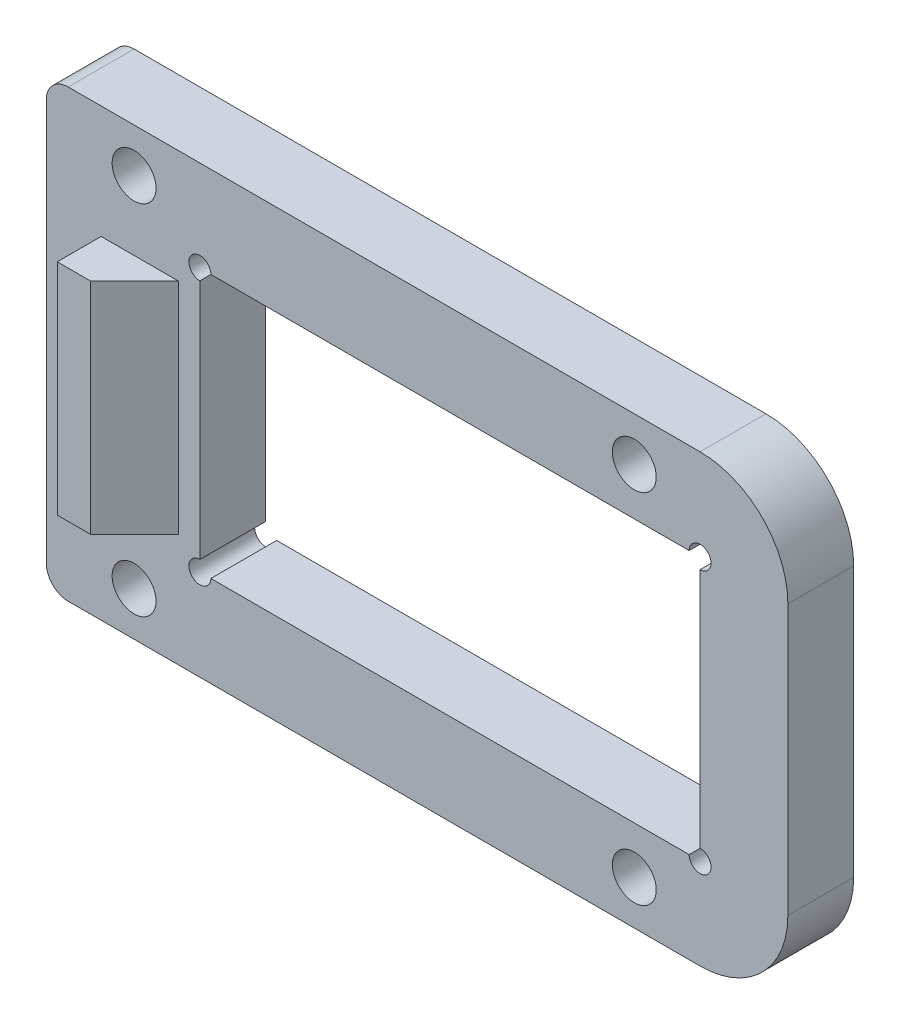
ISO-10303-21;
HEADER;
FILE_DESCRIPTION(('STEP AP214'),'2;1');
FILE_NAME('part.step','',(''),(''),'','','');
FILE_SCHEMA(('AUTOMOTIVE_DESIGN { 1 0 10303 214 1 1 1 1 }'));
ENDSEC;
DATA;
#1=APPLICATION_CONTEXT('core data for automotive mechanical design processes');
#2=APPLICATION_PROTOCOL_DEFINITION('international standard','automotive_design',2000,#1);
#3=PRODUCT_CONTEXT('',#1,'mechanical');
#4=PRODUCT('Part','Part','',(#3));
#5=PRODUCT_RELATED_PRODUCT_CATEGORY('part','',(#4));
#6=PRODUCT_DEFINITION_FORMATION('','',#4);
#7=PRODUCT_DEFINITION_CONTEXT('part definition',#1,'design');
#8=PRODUCT_DEFINITION('design','',#6,#7);
#9=PRODUCT_DEFINITION_SHAPE('','',#8);
#10=(LENGTH_UNIT() NAMED_UNIT(*) SI_UNIT(.MILLI.,.METRE.));
#11=(NAMED_UNIT(*) PLANE_ANGLE_UNIT() SI_UNIT($,.RADIAN.));
#12=(NAMED_UNIT(*) SI_UNIT($,.STERADIAN.) SOLID_ANGLE_UNIT());
#13=UNCERTAINTY_MEASURE_WITH_UNIT(LENGTH_MEASURE(1.E-05),#10,'distance_accuracy_value','');
#14=(GEOMETRIC_REPRESENTATION_CONTEXT(3) GLOBAL_UNCERTAINTY_ASSIGNED_CONTEXT((#13)) GLOBAL_UNIT_ASSIGNED_CONTEXT((#10,
#11,#12)) REPRESENTATION_CONTEXT('',''));
#15=CARTESIAN_POINT('',(0.,0.,0.));
#16=DIRECTION('',(0.,0.,1.));
#17=DIRECTION('',(1.,0.,0.));
#18=AXIS2_PLACEMENT_3D('',#15,#16,#17);
#19=CARTESIAN_POINT('',(0.,0.,3.));
#20=DIRECTION('',(0.,0.,1.));
#21=DIRECTION('',(1.,0.,0.));
#22=AXIS2_PLACEMENT_3D('',#19,#20,#21);
#23=PLANE('',#22);
#24=DIRECTION('',(0.,-1.,0.));
#25=VECTOR('',#24,1.);
#26=CARTESIAN_POINT('',(23.7012187742529,0.,3.));
#27=LINE('',#26,#25);
#28=CARTESIAN_POINT('',(23.7012187742529,5.79297996522203,3.));
#29=VERTEX_POINT('',#28);
#30=CARTESIAN_POINT('',(23.7012187742529,-4.20702003477797,3.));
#31=VERTEX_POINT('',#30);
#32=EDGE_CURVE('E245',#29,#31,#27,.T.);
#33=ORIENTED_EDGE('',*,*,#32,.T.);
#34=DIRECTION('',(1.,0.,0.));
#35=VECTOR('',#34,1.);
#36=CARTESIAN_POINT('',(0.,-4.20702003477797,3.));
#37=LINE('',#36,#35);
#38=CARTESIAN_POINT('',(20.185959930444,-4.20702003477797,3.));
#39=VERTEX_POINT('',#38);
#40=EDGE_CURVE('E238',#39,#31,#37,.T.);
#41=ORIENTED_EDGE('',*,*,#40,.F.);
#42=DIRECTION('',(0.,-1.,0.));
#43=VECTOR('',#42,1.);
#44=CARTESIAN_POINT('',(20.185959930444,0.,3.));
#45=LINE('',#44,#43);
#46=CARTESIAN_POINT('',(20.185959930444,5.79297996522203,3.));
#47=VERTEX_POINT('',#46);
#48=EDGE_CURVE('E241',#47,#39,#45,.T.);
#49=ORIENTED_EDGE('',*,*,#48,.F.);
#50=DIRECTION('',(1.,0.,0.));
#51=VECTOR('',#50,1.);
#52=CARTESIAN_POINT('',(0.,5.79297996522203,3.));
#53=LINE('',#52,#51);
#54=EDGE_CURVE('E220',#47,#29,#53,.T.);
#55=ORIENTED_EDGE('',*,*,#54,.T.);
#56=EDGE_LOOP('',(#33,#41,#49,#55));
#57=FACE_BOUND('',#56,.T.);
#58=DIRECTION('',(0.,-1.,0.));
#59=VECTOR('',#58,1.);
#60=CARTESIAN_POINT('',(47.485959930444,0.,3.));
#61=LINE('',#60,#59);
#62=CARTESIAN_POINT('',(47.485959930444,6.29297996522203,3.));
#63=VERTEX_POINT('',#62);
#64=CARTESIAN_POINT('',(47.485959930444,-4.70702003477797,3.));
#65=VERTEX_POINT('',#64);
#66=EDGE_CURVE('E304',#63,#65,#61,.T.);
#67=ORIENTED_EDGE('',*,*,#66,.T.);
#68=CARTESIAN_POINT('',(47.485959930444,-5.20702003477797,3.));
#69=DIRECTION('',(0.,0.,-1.));
#70=DIRECTION('',(1.,0.,0.));
#71=AXIS2_PLACEMENT_3D('',#68,#69,#70);
#72=CIRCLE('',#71,0.5);
#73=CARTESIAN_POINT('',(46.985959930444,-5.20702003477797,3.));
#74=VERTEX_POINT('',#73);
#75=EDGE_CURVE('E257',#65,#74,#72,.T.);
#76=ORIENTED_EDGE('',*,*,#75,.T.);
#77=DIRECTION('',(1.,0.,0.));
#78=VECTOR('',#77,1.);
#79=CARTESIAN_POINT('',(0.,-5.20702003477798,3.));
#80=LINE('',#79,#78);
#81=CARTESIAN_POINT('',(25.185959930444,-5.20702003477797,3.));
#82=VERTEX_POINT('',#81);
#83=EDGE_CURVE('E266',#82,#74,#80,.T.);
#84=ORIENTED_EDGE('',*,*,#83,.F.);
#85=CARTESIAN_POINT('',(24.685959930444,-5.20702003477797,3.));
#86=DIRECTION('',(0.,0.,-1.));
#87=DIRECTION('',(1.,0.,0.));
#88=AXIS2_PLACEMENT_3D('',#85,#86,#87);
#89=CIRCLE('',#88,0.5);
#90=CARTESIAN_POINT('',(24.685959930444,-4.70702003477798,3.));
#91=VERTEX_POINT('',#90);
#92=EDGE_CURVE('E263',#82,#91,#89,.T.);
#93=ORIENTED_EDGE('',*,*,#92,.T.);
#94=DIRECTION('',(0.,-1.,0.));
#95=VECTOR('',#94,1.);
#96=CARTESIAN_POINT('',(24.685959930444,0.,3.));
#97=LINE('',#96,#95);
#98=CARTESIAN_POINT('',(24.685959930444,6.29297996522203,3.));
#99=VERTEX_POINT('',#98);
#100=EDGE_CURVE('E314',#99,#91,#97,.T.);
#101=ORIENTED_EDGE('',*,*,#100,.F.);
#102=CARTESIAN_POINT('',(24.685959930444,6.79297996522203,3.));
#103=DIRECTION('',(0.,0.,1.));
#104=DIRECTION('',(1.,0.,0.));
#105=AXIS2_PLACEMENT_3D('',#102,#103,#104);
#106=CIRCLE('',#105,0.5);
#107=CARTESIAN_POINT('',(25.185959930444,6.79297996522203,3.));
#108=VERTEX_POINT('',#107);
#109=EDGE_CURVE('E316',#108,#99,#106,.T.);
#110=ORIENTED_EDGE('',*,*,#109,.F.);
#111=DIRECTION('',(1.,0.,0.));
#112=VECTOR('',#111,1.);
#113=CARTESIAN_POINT('',(0.,6.79297996522203,3.));
#114=LINE('',#113,#112);
#115=CARTESIAN_POINT('',(46.985959930444,6.79297996522203,3.));
#116=VERTEX_POINT('',#115);
#117=EDGE_CURVE('E319',#108,#116,#114,.T.);
#118=ORIENTED_EDGE('',*,*,#117,.T.);
#119=CARTESIAN_POINT('',(47.485959930444,6.79297996522203,3.));
#120=DIRECTION('',(0.,0.,1.));
#121=DIRECTION('',(1.,0.,0.));
#122=AXIS2_PLACEMENT_3D('',#119,#120,#121);
#123=CIRCLE('',#122,0.5);
#124=EDGE_CURVE('E301',#63,#116,#123,.T.);
#125=ORIENTED_EDGE('',*,*,#124,.F.);
#126=EDGE_LOOP('',(#67,#76,#84,#93,#101,#110,#118,#125));
#127=FACE_BOUND('',#126,.T.);
#128=CARTESIAN_POINT('',(21.685959930444,8.94297996522203,3.));
#129=DIRECTION('',(0.,0.,1.));
#130=DIRECTION('',(1.,0.,0.));
#131=AXIS2_PLACEMENT_3D('',#128,#129,#130);
#132=CIRCLE('',#131,1.);
#133=CARTESIAN_POINT('',(22.685959930444,8.94297996522203,3.));
#134=VERTEX_POINT('',#133);
#135=EDGE_CURVE('E321',#134,#134,#132,.T.);
#136=ORIENTED_EDGE('',*,*,#135,.F.);
#137=EDGE_LOOP('',(#136));
#138=FACE_BOUND('',#137,.T.);
#139=DIRECTION('',(1.,0.,0.));
#140=VECTOR('',#139,1.);
#141=CARTESIAN_POINT('',(0.,10.942979965222,3.));
#142=LINE('',#141,#140);
#143=CARTESIAN_POINT('',(18.685959930444,10.942979965222,3.));
#144=VERTEX_POINT('',#143);
#145=CARTESIAN_POINT('',(47.485959930444,10.942979965222,3.));
#146=VERTEX_POINT('',#145);
#147=EDGE_CURVE('E310',#144,#146,#142,.T.);
#148=ORIENTED_EDGE('',*,*,#147,.F.);
#149=CARTESIAN_POINT('',(18.685959930444,9.94297996522203,3.));
#150=DIRECTION('',(0.,0.,1.));
#151=DIRECTION('',(1.,0.,0.));
#152=AXIS2_PLACEMENT_3D('',#149,#150,#151);
#153=CIRCLE('',#152,1.);
#154=CARTESIAN_POINT('',(17.685959930444,9.94297996522203,3.));
#155=VERTEX_POINT('',#154);
#156=EDGE_CURVE('E82',#144,#155,#153,.T.);
#157=ORIENTED_EDGE('',*,*,#156,.T.);
#158=DIRECTION('',(0.,-1.,0.));
#159=VECTOR('',#158,1.);
#160=CARTESIAN_POINT('',(17.6859599304441,0.,3.));
#161=LINE('',#160,#159);
#162=CARTESIAN_POINT('',(17.6859599304441,-8.35702003477798,3.));
#163=VERTEX_POINT('',#162);
#164=EDGE_CURVE('E312',#155,#163,#161,.T.);
#165=ORIENTED_EDGE('',*,*,#164,.T.);
#166=CARTESIAN_POINT('',(18.6859599304441,-8.35702003477798,3.));
#167=DIRECTION('',(0.,0.,1.));
#168=DIRECTION('',(1.,0.,0.));
#169=AXIS2_PLACEMENT_3D('',#166,#167,#168);
#170=CIRCLE('',#169,1.);
#171=CARTESIAN_POINT('',(18.6859599304441,-9.35702003477798,3.));
#172=VERTEX_POINT('',#171);
#173=EDGE_CURVE('E89',#163,#172,#170,.T.);
#174=ORIENTED_EDGE('',*,*,#173,.T.);
#175=DIRECTION('',(1.,0.,0.));
#176=VECTOR('',#175,1.);
#177=CARTESIAN_POINT('',(0.,-9.35702003477798,3.));
#178=LINE('',#177,#176);
#179=CARTESIAN_POINT('',(47.485959930444,-9.35702003477797,3.));
#180=VERTEX_POINT('',#179);
#181=EDGE_CURVE('E260',#172,#180,#178,.T.);
#182=ORIENTED_EDGE('',*,*,#181,.T.);
#183=CARTESIAN_POINT('',(47.485959930444,-5.35702003477797,3.));
#184=DIRECTION('',(0.,0.,1.));
#185=DIRECTION('',(1.,0.,0.));
#186=AXIS2_PLACEMENT_3D('',#183,#184,#185);
#187=CIRCLE('',#186,4.);
#188=CARTESIAN_POINT('',(51.485959930444,-5.35702003477797,3.));
#189=VERTEX_POINT('',#188);
#190=EDGE_CURVE('E372',#180,#189,#187,.T.);
#191=ORIENTED_EDGE('',*,*,#190,.T.);
#192=DIRECTION('',(0.,-1.,0.));
#193=VECTOR('',#192,1.);
#194=CARTESIAN_POINT('',(51.485959930444,0.,3.));
#195=LINE('',#194,#193);
#196=CARTESIAN_POINT('',(51.485959930444,6.94297996522203,3.));
#197=VERTEX_POINT('',#196);
#198=EDGE_CURVE('E307',#197,#189,#195,.T.);
#199=ORIENTED_EDGE('',*,*,#198,.F.);
#200=CARTESIAN_POINT('',(47.485959930444,6.94297996522203,3.));
#201=DIRECTION('',(0.,0.,1.));
#202=DIRECTION('',(1.,0.,0.));
#203=AXIS2_PLACEMENT_3D('',#200,#201,#202);
#204=CIRCLE('',#203,4.);
#205=EDGE_CURVE('E374',#197,#146,#204,.T.);
#206=ORIENTED_EDGE('',*,*,#205,.T.);
#207=EDGE_LOOP('',(#148,#157,#165,#174,#182,#191,#199,#206));
#208=FACE_BOUND('',#207,.T.);
#209=CARTESIAN_POINT('',(44.485959930444,8.94297996522203,3.));
#210=DIRECTION('',(0.,0.,1.));
#211=DIRECTION('',(1.,0.,0.));
#212=AXIS2_PLACEMENT_3D('',#209,#210,#211);
#213=CIRCLE('',#212,0.999999999999998);
#214=CARTESIAN_POINT('',(45.485959930444,8.94297996522203,3.));
#215=VERTEX_POINT('',#214);
#216=EDGE_CURVE('E295',#215,#215,#213,.T.);
#217=ORIENTED_EDGE('',*,*,#216,.F.);
#218=EDGE_LOOP('',(#217));
#219=FACE_BOUND('',#218,.T.);
#220=CARTESIAN_POINT('',(21.685959930444,-7.35702003477797,3.));
#221=DIRECTION('',(0.,0.,-1.));
#222=DIRECTION('',(1.,0.,0.));
#223=AXIS2_PLACEMENT_3D('',#220,#221,#222);
#224=CIRCLE('',#223,1.);
#225=CARTESIAN_POINT('',(22.685959930444,-7.35702003477797,3.));
#226=VERTEX_POINT('',#225);
#227=EDGE_CURVE('E269',#226,#226,#224,.T.);
#228=ORIENTED_EDGE('',*,*,#227,.T.);
#229=EDGE_LOOP('',(#228));
#230=FACE_BOUND('',#229,.T.);
#231=CARTESIAN_POINT('',(44.485959930444,-7.35702003477797,3.));
#232=DIRECTION('',(0.,0.,-1.));
#233=DIRECTION('',(1.,0.,0.));
#234=AXIS2_PLACEMENT_3D('',#231,#232,#233);
#235=CIRCLE('',#234,0.999999999999998);
#236=CARTESIAN_POINT('',(45.485959930444,-7.35702003477797,3.));
#237=VERTEX_POINT('',#236);
#238=EDGE_CURVE('E251',#237,#237,#235,.T.);
#239=ORIENTED_EDGE('',*,*,#238,.T.);
#240=EDGE_LOOP('',(#239));
#241=FACE_BOUND('',#240,.T.);
#242=ADVANCED_FACE('F74',(#57,#127,#138,#208,#219,#230,#241),#23,.T.);
#243=CARTESIAN_POINT('',(0.,0.,0.));
#244=DIRECTION('',(0.,0.,1.));
#245=DIRECTION('',(1.,0.,0.));
#246=AXIS2_PLACEMENT_3D('',#243,#244,#245);
#247=PLANE('',#246);
#248=CARTESIAN_POINT('',(47.485959930444,-5.20702003477797,0.));
#249=DIRECTION('',(0.,0.,-1.));
#250=DIRECTION('',(1.,0.,0.));
#251=AXIS2_PLACEMENT_3D('',#248,#249,#250);
#252=CIRCLE('',#251,0.5);
#253=CARTESIAN_POINT('',(47.485959930444,-4.70702003477797,0.));
#254=VERTEX_POINT('',#253);
#255=CARTESIAN_POINT('',(46.985959930444,-5.20702003477797,0.));
#256=VERTEX_POINT('',#255);
#257=EDGE_CURVE('E254',#254,#256,#252,.T.);
#258=ORIENTED_EDGE('',*,*,#257,.F.);
#259=DIRECTION('',(0.,-1.,0.));
#260=VECTOR('',#259,1.);
#261=CARTESIAN_POINT('',(47.485959930444,0.,0.));
#262=LINE('',#261,#260);
#263=CARTESIAN_POINT('',(47.485959930444,6.29297996522203,0.));
#264=VERTEX_POINT('',#263);
#265=EDGE_CURVE('E327',#264,#254,#262,.T.);
#266=ORIENTED_EDGE('',*,*,#265,.F.);
#267=CARTESIAN_POINT('',(47.485959930444,6.79297996522203,0.));
#268=DIRECTION('',(0.,0.,1.));
#269=DIRECTION('',(1.,0.,0.));
#270=AXIS2_PLACEMENT_3D('',#267,#268,#269);
#271=CIRCLE('',#270,0.5);
#272=CARTESIAN_POINT('',(46.985959930444,6.79297996522203,0.));
#273=VERTEX_POINT('',#272);
#274=EDGE_CURVE('E298',#264,#273,#271,.T.);
#275=ORIENTED_EDGE('',*,*,#274,.T.);
#276=DIRECTION('',(1.,0.,0.));
#277=VECTOR('',#276,1.);
#278=CARTESIAN_POINT('',(0.,6.79297996522203,0.));
#279=LINE('',#278,#277);
#280=CARTESIAN_POINT('',(25.185959930444,6.79297996522203,0.));
#281=VERTEX_POINT('',#280);
#282=EDGE_CURVE('E342',#281,#273,#279,.T.);
#283=ORIENTED_EDGE('',*,*,#282,.F.);
#284=CARTESIAN_POINT('',(24.685959930444,6.79297996522203,0.));
#285=DIRECTION('',(0.,0.,1.));
#286=DIRECTION('',(1.,0.,0.));
#287=AXIS2_PLACEMENT_3D('',#284,#285,#286);
#288=CIRCLE('',#287,0.5);
#289=CARTESIAN_POINT('',(24.685959930444,6.29297996522203,0.));
#290=VERTEX_POINT('',#289);
#291=EDGE_CURVE('E339',#281,#290,#288,.T.);
#292=ORIENTED_EDGE('',*,*,#291,.T.);
#293=DIRECTION('',(0.,-1.,0.));
#294=VECTOR('',#293,1.);
#295=CARTESIAN_POINT('',(24.685959930444,0.,0.));
#296=LINE('',#295,#294);
#297=CARTESIAN_POINT('',(24.685959930444,-4.70702003477798,0.));
#298=VERTEX_POINT('',#297);
#299=EDGE_CURVE('E337',#290,#298,#296,.T.);
#300=ORIENTED_EDGE('',*,*,#299,.T.);
#301=CARTESIAN_POINT('',(24.685959930444,-5.20702003477797,0.));
#302=DIRECTION('',(0.,0.,-1.));
#303=DIRECTION('',(1.,0.,0.));
#304=AXIS2_PLACEMENT_3D('',#301,#302,#303);
#305=CIRCLE('',#304,0.5);
#306=CARTESIAN_POINT('',(25.185959930444,-5.20702003477797,0.));
#307=VERTEX_POINT('',#306);
#308=EDGE_CURVE('E277',#307,#298,#305,.T.);
#309=ORIENTED_EDGE('',*,*,#308,.F.);
#310=DIRECTION('',(1.,0.,0.));
#311=VECTOR('',#310,1.);
#312=CARTESIAN_POINT('',(0.,-5.20702003477798,0.));
#313=LINE('',#312,#311);
#314=EDGE_CURVE('E280',#307,#256,#313,.T.);
#315=ORIENTED_EDGE('',*,*,#314,.T.);
#316=EDGE_LOOP('',(#258,#266,#275,#283,#292,#300,#309,#315));
#317=FACE_BOUND('',#316,.T.);
#318=DIRECTION('',(0.,-1.,0.));
#319=VECTOR('',#318,1.);
#320=CARTESIAN_POINT('',(17.6859599304441,0.,0.));
#321=LINE('',#320,#319);
#322=CARTESIAN_POINT('',(17.685959930444,9.94297996522203,0.));
#323=VERTEX_POINT('',#322);
#324=CARTESIAN_POINT('',(17.6859599304441,-8.35702003477798,0.));
#325=VERTEX_POINT('',#324);
#326=EDGE_CURVE('E334',#323,#325,#321,.T.);
#327=ORIENTED_EDGE('',*,*,#326,.F.);
#328=CARTESIAN_POINT('',(18.685959930444,9.94297996522203,0.));
#329=DIRECTION('',(0.,0.,1.));
#330=DIRECTION('',(1.,0.,0.));
#331=AXIS2_PLACEMENT_3D('',#328,#329,#330);
#332=CIRCLE('',#331,1.);
#333=CARTESIAN_POINT('',(18.685959930444,10.942979965222,0.));
#334=VERTEX_POINT('',#333);
#335=EDGE_CURVE('E387',#323,#334,#332,.F.);
#336=ORIENTED_EDGE('',*,*,#335,.T.);
#337=DIRECTION('',(1.,0.,0.));
#338=VECTOR('',#337,1.);
#339=CARTESIAN_POINT('',(0.,10.942979965222,0.));
#340=LINE('',#339,#338);
#341=CARTESIAN_POINT('',(47.485959930444,10.942979965222,0.));
#342=VERTEX_POINT('',#341);
#343=EDGE_CURVE('E332',#334,#342,#340,.T.);
#344=ORIENTED_EDGE('',*,*,#343,.T.);
#345=CARTESIAN_POINT('',(47.485959930444,6.94297996522203,0.));
#346=DIRECTION('',(0.,0.,1.));
#347=DIRECTION('',(1.,0.,0.));
#348=AXIS2_PLACEMENT_3D('',#345,#346,#347);
#349=CIRCLE('',#348,4.);
#350=CARTESIAN_POINT('',(51.485959930444,6.94297996522203,0.));
#351=VERTEX_POINT('',#350);
#352=EDGE_CURVE('E365',#342,#351,#349,.F.);
#353=ORIENTED_EDGE('',*,*,#352,.T.);
#354=DIRECTION('',(0.,-1.,0.));
#355=VECTOR('',#354,1.);
#356=CARTESIAN_POINT('',(51.485959930444,0.,0.));
#357=LINE('',#356,#355);
#358=CARTESIAN_POINT('',(51.485959930444,-5.35702003477797,0.));
#359=VERTEX_POINT('',#358);
#360=EDGE_CURVE('E329',#351,#359,#357,.T.);
#361=ORIENTED_EDGE('',*,*,#360,.T.);
#362=CARTESIAN_POINT('',(47.485959930444,-5.35702003477797,0.));
#363=DIRECTION('',(0.,0.,1.));
#364=DIRECTION('',(1.,0.,0.));
#365=AXIS2_PLACEMENT_3D('',#362,#363,#364);
#366=CIRCLE('',#365,4.);
#367=CARTESIAN_POINT('',(47.485959930444,-9.35702003477797,0.));
#368=VERTEX_POINT('',#367);
#369=EDGE_CURVE('E362',#359,#368,#366,.F.);
#370=ORIENTED_EDGE('',*,*,#369,.T.);
#371=DIRECTION('',(1.,0.,0.));
#372=VECTOR('',#371,1.);
#373=CARTESIAN_POINT('',(0.,-9.35702003477798,0.));
#374=LINE('',#373,#372);
#375=CARTESIAN_POINT('',(18.6859599304441,-9.35702003477798,0.));
#376=VERTEX_POINT('',#375);
#377=EDGE_CURVE('E275',#376,#368,#374,.T.);
#378=ORIENTED_EDGE('',*,*,#377,.F.);
#379=CARTESIAN_POINT('',(18.6859599304441,-8.35702003477798,0.));
#380=DIRECTION('',(0.,0.,1.));
#381=DIRECTION('',(1.,0.,0.));
#382=AXIS2_PLACEMENT_3D('',#379,#380,#381);
#383=CIRCLE('',#382,1.);
#384=EDGE_CURVE('E385',#376,#325,#383,.F.);
#385=ORIENTED_EDGE('',*,*,#384,.T.);
#386=EDGE_LOOP('',(#327,#336,#344,#353,#361,#370,#378,#385));
#387=FACE_BOUND('',#386,.T.);
#388=CARTESIAN_POINT('',(21.685959930444,8.94297996522203,0.));
#389=DIRECTION('',(0.,0.,1.));
#390=DIRECTION('',(1.,0.,0.));
#391=AXIS2_PLACEMENT_3D('',#388,#389,#390);
#392=CIRCLE('',#391,1.);
#393=CARTESIAN_POINT('',(22.685959930444,8.94297996522203,0.));
#394=VERTEX_POINT('',#393);
#395=EDGE_CURVE('E305',#394,#394,#392,.T.);
#396=ORIENTED_EDGE('',*,*,#395,.T.);
#397=EDGE_LOOP('',(#396));
#398=FACE_BOUND('',#397,.T.);
#399=CARTESIAN_POINT('',(44.485959930444,8.94297996522203,0.));
#400=DIRECTION('',(0.,0.,1.));
#401=DIRECTION('',(1.,0.,0.));
#402=AXIS2_PLACEMENT_3D('',#399,#400,#401);
#403=CIRCLE('',#402,0.999999999999998);
#404=CARTESIAN_POINT('',(45.485959930444,8.94297996522203,0.));
#405=VERTEX_POINT('',#404);
#406=EDGE_CURVE('E294',#405,#405,#403,.T.);
#407=ORIENTED_EDGE('',*,*,#406,.T.);
#408=EDGE_LOOP('',(#407));
#409=FACE_BOUND('',#408,.T.);
#410=CARTESIAN_POINT('',(21.685959930444,-7.35702003477797,0.));
#411=DIRECTION('',(0.,0.,-1.));
#412=DIRECTION('',(1.,0.,0.));
#413=AXIS2_PLACEMENT_3D('',#410,#411,#412);
#414=CIRCLE('',#413,1.);
#415=CARTESIAN_POINT('',(22.685959930444,-7.35702003477797,0.));
#416=VERTEX_POINT('',#415);
#417=EDGE_CURVE('E261',#416,#416,#414,.T.);
#418=ORIENTED_EDGE('',*,*,#417,.F.);
#419=EDGE_LOOP('',(#418));
#420=FACE_BOUND('',#419,.T.);
#421=CARTESIAN_POINT('',(44.485959930444,-7.35702003477797,0.));
#422=DIRECTION('',(0.,0.,-1.));
#423=DIRECTION('',(1.,0.,0.));
#424=AXIS2_PLACEMENT_3D('',#421,#422,#423);
#425=CIRCLE('',#424,0.999999999999998);
#426=CARTESIAN_POINT('',(45.485959930444,-7.35702003477797,0.));
#427=VERTEX_POINT('',#426);
#428=EDGE_CURVE('E224',#427,#427,#425,.T.);
#429=ORIENTED_EDGE('',*,*,#428,.F.);
#430=EDGE_LOOP('',(#429));
#431=FACE_BOUND('',#430,.T.);
#432=ADVANCED_FACE('F401',(#317,#387,#398,#409,#420,#431),#247,.F.);
#433=CARTESIAN_POINT('',(47.485959930444,6.79297996522203,3.));
#434=DIRECTION('',(0.,0.,-1.));
#435=DIRECTION('',(-1.,0.,0.));
#436=AXIS2_PLACEMENT_3D('',#433,#434,#435);
#437=CYLINDRICAL_SURFACE('',#436,0.5);
#438=ORIENTED_EDGE('',*,*,#274,.F.);
#439=DIRECTION('',(0.,0.,-1.));
#440=VECTOR('',#439,1.);
#441=CARTESIAN_POINT('',(47.485959930444,6.29297996522203,3.));
#442=LINE('',#441,#440);
#443=EDGE_CURVE('E352',#63,#264,#442,.T.);
#444=ORIENTED_EDGE('',*,*,#443,.F.);
#445=ORIENTED_EDGE('',*,*,#124,.T.);
#446=DIRECTION('',(0.,0.,-1.));
#447=VECTOR('',#446,1.);
#448=CARTESIAN_POINT('',(46.985959930444,6.79297996522203,3.));
#449=LINE('',#448,#447);
#450=EDGE_CURVE('E324',#116,#273,#449,.T.);
#451=ORIENTED_EDGE('',*,*,#450,.T.);
#452=EDGE_LOOP('',(#438,#444,#445,#451));
#453=FACE_BOUND('',#452,.T.);
#454=ADVANCED_FACE('F434',(#453),#437,.F.);
#455=CARTESIAN_POINT('',(47.485959930444,0.,3.));
#456=DIRECTION('',(1.,0.,0.));
#457=DIRECTION('',(0.,0.,-1.));
#458=AXIS2_PLACEMENT_3D('',#455,#456,#457);
#459=PLANE('',#458);
#460=ORIENTED_EDGE('',*,*,#265,.T.);
#461=DIRECTION('',(0.,0.,-1.));
#462=VECTOR('',#461,1.);
#463=CARTESIAN_POINT('',(47.485959930444,-4.70702003477797,3.));
#464=LINE('',#463,#462);
#465=EDGE_CURVE('E291',#65,#254,#464,.T.);
#466=ORIENTED_EDGE('',*,*,#465,.F.);
#467=ORIENTED_EDGE('',*,*,#66,.F.);
#468=ORIENTED_EDGE('',*,*,#443,.T.);
#469=EDGE_LOOP('',(#460,#466,#467,#468));
#470=FACE_BOUND('',#469,.T.);
#471=ADVANCED_FACE('F464',(#470),#459,.F.);
#472=CARTESIAN_POINT('',(51.485959930444,0.,3.));
#473=DIRECTION('',(1.,0.,0.));
#474=DIRECTION('',(0.,0.,-1.));
#475=AXIS2_PLACEMENT_3D('',#472,#473,#474);
#476=PLANE('',#475);
#477=ORIENTED_EDGE('',*,*,#360,.F.);
#478=DIRECTION('',(0.,0.,-1.));
#479=VECTOR('',#478,1.);
#480=CARTESIAN_POINT('',(51.485959930444,6.94297996522203,3.));
#481=LINE('',#480,#479);
#482=EDGE_CURVE('E370',#351,#197,#481,.F.);
#483=ORIENTED_EDGE('',*,*,#482,.T.);
#484=ORIENTED_EDGE('',*,*,#198,.T.);
#485=DIRECTION('',(0.,0.,-1.));
#486=VECTOR('',#485,1.);
#487=CARTESIAN_POINT('',(51.485959930444,-5.35702003477797,3.));
#488=LINE('',#487,#486);
#489=EDGE_CURVE('E367',#189,#359,#488,.T.);
#490=ORIENTED_EDGE('',*,*,#489,.T.);
#491=EDGE_LOOP('',(#477,#483,#484,#490));
#492=FACE_BOUND('',#491,.T.);
#493=ADVANCED_FACE('F412',(#492),#476,.T.);
#494=CARTESIAN_POINT('',(0.,10.942979965222,3.));
#495=DIRECTION('',(0.,1.,0.));
#496=DIRECTION('',(-1.,0.,0.));
#497=AXIS2_PLACEMENT_3D('',#494,#495,#496);
#498=PLANE('',#497);
#499=ORIENTED_EDGE('',*,*,#343,.F.);
#500=DIRECTION('',(0.,0.,-1.));
#501=VECTOR('',#500,1.);
#502=CARTESIAN_POINT('',(18.685959930444,10.942979965222,3.));
#503=LINE('',#502,#501);
#504=EDGE_CURVE('E97',#334,#144,#503,.F.);
#505=ORIENTED_EDGE('',*,*,#504,.T.);
#506=ORIENTED_EDGE('',*,*,#147,.T.);
#507=DIRECTION('',(0.,0.,-1.));
#508=VECTOR('',#507,1.);
#509=CARTESIAN_POINT('',(47.485959930444,10.942979965222,3.));
#510=LINE('',#509,#508);
#511=EDGE_CURVE('E359',#146,#342,#510,.T.);
#512=ORIENTED_EDGE('',*,*,#511,.T.);
#513=EDGE_LOOP('',(#499,#505,#506,#512));
#514=FACE_BOUND('',#513,.T.);
#515=ADVANCED_FACE('F404',(#514),#498,.T.);
#516=CARTESIAN_POINT('',(17.6859599304441,0.,3.));
#517=DIRECTION('',(1.,0.,0.));
#518=DIRECTION('',(0.,1.,0.));
#519=AXIS2_PLACEMENT_3D('',#516,#517,#518);
#520=PLANE('',#519);
#521=ORIENTED_EDGE('',*,*,#164,.F.);
#522=DIRECTION('',(0.,0.,-1.));
#523=VECTOR('',#522,1.);
#524=CARTESIAN_POINT('',(17.685959930444,9.94297996522203,0.));
#525=LINE('',#524,#523);
#526=EDGE_CURVE('E382',#155,#323,#525,.T.);
#527=ORIENTED_EDGE('',*,*,#526,.T.);
#528=ORIENTED_EDGE('',*,*,#326,.T.);
#529=DIRECTION('',(0.,0.,-1.));
#530=VECTOR('',#529,1.);
#531=CARTESIAN_POINT('',(17.6859599304441,-8.35702003477798,3.));
#532=LINE('',#531,#530);
#533=EDGE_CURVE('E380',#325,#163,#532,.F.);
#534=ORIENTED_EDGE('',*,*,#533,.T.);
#535=EDGE_LOOP('',(#521,#527,#528,#534));
#536=FACE_BOUND('',#535,.T.);
#537=ADVANCED_FACE('F396',(#536),#520,.F.);
#538=CARTESIAN_POINT('',(24.685959930444,0.,3.));
#539=DIRECTION('',(1.,0.,0.));
#540=DIRECTION('',(0.,0.,-1.));
#541=AXIS2_PLACEMENT_3D('',#538,#539,#540);
#542=PLANE('',#541);
#543=ORIENTED_EDGE('',*,*,#299,.F.);
#544=DIRECTION('',(0.,0.,-1.));
#545=VECTOR('',#544,1.);
#546=CARTESIAN_POINT('',(24.685959930444,6.29297996522203,3.));
#547=LINE('',#546,#545);
#548=EDGE_CURVE('E350',#99,#290,#547,.T.);
#549=ORIENTED_EDGE('',*,*,#548,.F.);
#550=ORIENTED_EDGE('',*,*,#100,.T.);
#551=DIRECTION('',(0.,0.,-1.));
#552=VECTOR('',#551,1.);
#553=CARTESIAN_POINT('',(24.685959930444,-4.70702003477798,3.));
#554=LINE('',#553,#552);
#555=EDGE_CURVE('E288',#91,#298,#554,.T.);
#556=ORIENTED_EDGE('',*,*,#555,.T.);
#557=EDGE_LOOP('',(#543,#549,#550,#556));
#558=FACE_BOUND('',#557,.T.);
#559=ADVANCED_FACE('F453',(#558),#542,.T.);
#560=CARTESIAN_POINT('',(24.685959930444,6.79297996522203,3.));
#561=DIRECTION('',(0.,0.,-1.));
#562=DIRECTION('',(-1.,0.,0.));
#563=AXIS2_PLACEMENT_3D('',#560,#561,#562);
#564=CYLINDRICAL_SURFACE('',#563,0.5);
#565=ORIENTED_EDGE('',*,*,#291,.F.);
#566=DIRECTION('',(0.,0.,-1.));
#567=VECTOR('',#566,1.);
#568=CARTESIAN_POINT('',(25.185959930444,6.79297996522203,3.));
#569=LINE('',#568,#567);
#570=EDGE_CURVE('E348',#108,#281,#569,.T.);
#571=ORIENTED_EDGE('',*,*,#570,.F.);
#572=ORIENTED_EDGE('',*,*,#109,.T.);
#573=ORIENTED_EDGE('',*,*,#548,.T.);
#574=EDGE_LOOP('',(#565,#571,#572,#573));
#575=FACE_BOUND('',#574,.T.);
#576=ADVANCED_FACE('F449',(#575),#564,.F.);
#577=CARTESIAN_POINT('',(0.,6.79297996522203,3.));
#578=DIRECTION('',(0.,1.,0.));
#579=DIRECTION('',(-1.,0.,0.));
#580=AXIS2_PLACEMENT_3D('',#577,#578,#579);
#581=PLANE('',#580);
#582=ORIENTED_EDGE('',*,*,#282,.T.);
#583=ORIENTED_EDGE('',*,*,#450,.F.);
#584=ORIENTED_EDGE('',*,*,#117,.F.);
#585=ORIENTED_EDGE('',*,*,#570,.T.);
#586=EDGE_LOOP('',(#582,#583,#584,#585));
#587=FACE_BOUND('',#586,.T.);
#588=ADVANCED_FACE('F445',(#587),#581,.F.);
#589=CARTESIAN_POINT('',(21.685959930444,8.94297996522203,3.));
#590=DIRECTION('',(0.,0.,-1.));
#591=DIRECTION('',(-1.,0.,0.));
#592=AXIS2_PLACEMENT_3D('',#589,#590,#591);
#593=CYLINDRICAL_SURFACE('',#592,1.);
#594=ORIENTED_EDGE('',*,*,#135,.T.);
#595=EDGE_LOOP('',(#594));
#596=FACE_BOUND('',#595,.T.);
#597=ORIENTED_EDGE('',*,*,#395,.F.);
#598=EDGE_LOOP('',(#597));
#599=FACE_BOUND('',#598,.T.);
#600=ADVANCED_FACE('F442',(#596,#599),#593,.F.);
#601=CARTESIAN_POINT('',(44.485959930444,8.94297996522203,3.));
#602=DIRECTION('',(0.,0.,-1.));
#603=DIRECTION('',(-1.,0.,0.));
#604=AXIS2_PLACEMENT_3D('',#601,#602,#603);
#605=CYLINDRICAL_SURFACE('',#604,0.999999999999998);
#606=ORIENTED_EDGE('',*,*,#216,.T.);
#607=EDGE_LOOP('',(#606));
#608=FACE_BOUND('',#607,.T.);
#609=ORIENTED_EDGE('',*,*,#406,.F.);
#610=EDGE_LOOP('',(#609));
#611=FACE_BOUND('',#610,.T.);
#612=ADVANCED_FACE('F439',(#608,#611),#605,.F.);
#613=CARTESIAN_POINT('',(47.485959930444,-5.20702003477797,3.));
#614=DIRECTION('',(0.,0.,-1.));
#615=DIRECTION('',(-1.,0.,0.));
#616=AXIS2_PLACEMENT_3D('',#613,#614,#615);
#617=CYLINDRICAL_SURFACE('',#616,0.5);
#618=ORIENTED_EDGE('',*,*,#257,.T.);
#619=DIRECTION('',(0.,0.,-1.));
#620=VECTOR('',#619,1.);
#621=CARTESIAN_POINT('',(46.985959930444,-5.20702003477797,3.));
#622=LINE('',#621,#620);
#623=EDGE_CURVE('E272',#74,#256,#622,.T.);
#624=ORIENTED_EDGE('',*,*,#623,.F.);
#625=ORIENTED_EDGE('',*,*,#75,.F.);
#626=ORIENTED_EDGE('',*,*,#465,.T.);
#627=EDGE_LOOP('',(#618,#624,#625,#626));
#628=FACE_BOUND('',#627,.T.);
#629=ADVANCED_FACE('F599',(#628),#617,.F.);
#630=CARTESIAN_POINT('',(0.,-9.35702003477798,3.));
#631=DIRECTION('',(0.,-1.,0.));
#632=DIRECTION('',(-1.,0.,0.));
#633=AXIS2_PLACEMENT_3D('',#630,#631,#632);
#634=PLANE('',#633);
#635=ORIENTED_EDGE('',*,*,#181,.F.);
#636=DIRECTION('',(0.,0.,-1.));
#637=VECTOR('',#636,1.);
#638=CARTESIAN_POINT('',(18.6859599304441,-9.35702003477798,0.));
#639=LINE('',#638,#637);
#640=EDGE_CURVE('E12',#172,#376,#639,.T.);
#641=ORIENTED_EDGE('',*,*,#640,.T.);
#642=ORIENTED_EDGE('',*,*,#377,.T.);
#643=DIRECTION('',(0.,0.,-1.));
#644=VECTOR('',#643,1.);
#645=CARTESIAN_POINT('',(47.485959930444,-9.35702003477797,3.));
#646=LINE('',#645,#644);
#647=EDGE_CURVE('E377',#368,#180,#646,.F.);
#648=ORIENTED_EDGE('',*,*,#647,.T.);
#649=EDGE_LOOP('',(#635,#641,#642,#648));
#650=FACE_BOUND('',#649,.T.);
#651=ADVANCED_FACE('F421',(#650),#634,.T.);
#652=CARTESIAN_POINT('',(24.685959930444,-5.20702003477797,3.));
#653=DIRECTION('',(0.,0.,-1.));
#654=DIRECTION('',(-1.,0.,0.));
#655=AXIS2_PLACEMENT_3D('',#652,#653,#654);
#656=CYLINDRICAL_SURFACE('',#655,0.5);
#657=ORIENTED_EDGE('',*,*,#308,.T.);
#658=ORIENTED_EDGE('',*,*,#555,.F.);
#659=ORIENTED_EDGE('',*,*,#92,.F.);
#660=DIRECTION('',(0.,0.,-1.));
#661=VECTOR('',#660,1.);
#662=CARTESIAN_POINT('',(25.185959930444,-5.20702003477797,3.));
#663=LINE('',#662,#661);
#664=EDGE_CURVE('E286',#82,#307,#663,.T.);
#665=ORIENTED_EDGE('',*,*,#664,.T.);
#666=EDGE_LOOP('',(#657,#658,#659,#665));
#667=FACE_BOUND('',#666,.T.);
#668=ADVANCED_FACE('F581',(#667),#656,.F.);
#669=CARTESIAN_POINT('',(0.,-5.20702003477798,3.));
#670=DIRECTION('',(0.,-1.,0.));
#671=DIRECTION('',(-1.,0.,0.));
#672=AXIS2_PLACEMENT_3D('',#669,#670,#671);
#673=PLANE('',#672);
#674=ORIENTED_EDGE('',*,*,#314,.F.);
#675=ORIENTED_EDGE('',*,*,#664,.F.);
#676=ORIENTED_EDGE('',*,*,#83,.T.);
#677=ORIENTED_EDGE('',*,*,#623,.T.);
#678=EDGE_LOOP('',(#674,#675,#676,#677));
#679=FACE_BOUND('',#678,.T.);
#680=ADVANCED_FACE('F571',(#679),#673,.F.);
#681=CARTESIAN_POINT('',(21.685959930444,-7.35702003477797,3.));
#682=DIRECTION('',(0.,0.,-1.));
#683=DIRECTION('',(-1.,0.,0.));
#684=AXIS2_PLACEMENT_3D('',#681,#682,#683);
#685=CYLINDRICAL_SURFACE('',#684,1.);
#686=ORIENTED_EDGE('',*,*,#227,.F.);
#687=EDGE_LOOP('',(#686));
#688=FACE_BOUND('',#687,.T.);
#689=ORIENTED_EDGE('',*,*,#417,.T.);
#690=EDGE_LOOP('',(#689));
#691=FACE_BOUND('',#690,.T.);
#692=ADVANCED_FACE('F561',(#688,#691),#685,.F.);
#693=CARTESIAN_POINT('',(44.485959930444,-7.35702003477797,3.));
#694=DIRECTION('',(0.,0.,-1.));
#695=DIRECTION('',(-1.,0.,0.));
#696=AXIS2_PLACEMENT_3D('',#693,#694,#695);
#697=CYLINDRICAL_SURFACE('',#696,0.999999999999998);
#698=ORIENTED_EDGE('',*,*,#238,.F.);
#699=EDGE_LOOP('',(#698));
#700=FACE_BOUND('',#699,.T.);
#701=ORIENTED_EDGE('',*,*,#428,.T.);
#702=EDGE_LOOP('',(#701));
#703=FACE_BOUND('',#702,.T.);
#704=ADVANCED_FACE('F552',(#700,#703),#697,.F.);
#705=CARTESIAN_POINT('',(0.,5.79297996522203,5.));
#706=DIRECTION('',(0.,1.,0.));
#707=DIRECTION('',(0.,0.,1.));
#708=AXIS2_PLACEMENT_3D('',#705,#706,#707);
#709=PLANE('',#708);
#710=DIRECTION('',(1.,0.,0.));
#711=VECTOR('',#710,1.);
#712=CARTESIAN_POINT('',(0.,5.79297996522203,5.));
#713=LINE('',#712,#711);
#714=CARTESIAN_POINT('',(20.185959930444,5.79297996522203,5.));
#715=VERTEX_POINT('',#714);
#716=CARTESIAN_POINT('',(21.7012187742529,5.79297996522203,5.));
#717=VERTEX_POINT('',#716);
#718=EDGE_CURVE('E217',#715,#717,#713,.T.);
#719=ORIENTED_EDGE('',*,*,#718,.T.);
#720=DIRECTION('',(-0.707106781186549,0.,0.707106781186546));
#721=VECTOR('',#720,1.);
#722=CARTESIAN_POINT('',(10.8506093871264,5.79297996522203,15.8506093871264));
#723=LINE('',#722,#721);
#724=EDGE_CURVE('E357',#717,#29,#723,.F.);
#725=ORIENTED_EDGE('',*,*,#724,.T.);
#726=ORIENTED_EDGE('',*,*,#54,.F.);
#727=DIRECTION('',(0.,0.,-1.));
#728=VECTOR('',#727,1.);
#729=CARTESIAN_POINT('',(20.185959930444,5.79297996522203,5.));
#730=LINE('',#729,#728);
#731=EDGE_CURVE('E213',#715,#47,#730,.T.);
#732=ORIENTED_EDGE('',*,*,#731,.F.);
#733=EDGE_LOOP('',(#719,#725,#726,#732));
#734=FACE_BOUND('',#733,.T.);
#735=ADVANCED_FACE('F215',(#734),#709,.T.);
#736=CARTESIAN_POINT('',(20.185959930444,0.,5.));
#737=DIRECTION('',(1.,0.,0.));
#738=DIRECTION('',(0.,0.,-1.));
#739=AXIS2_PLACEMENT_3D('',#736,#737,#738);
#740=PLANE('',#739);
#741=ORIENTED_EDGE('',*,*,#48,.T.);
#742=DIRECTION('',(0.,0.,-1.));
#743=VECTOR('',#742,1.);
#744=CARTESIAN_POINT('',(20.185959930444,-4.20702003477797,5.));
#745=LINE('',#744,#743);
#746=CARTESIAN_POINT('',(20.185959930444,-4.20702003477797,5.));
#747=VERTEX_POINT('',#746);
#748=EDGE_CURVE('E225',#747,#39,#745,.T.);
#749=ORIENTED_EDGE('',*,*,#748,.F.);
#750=DIRECTION('',(0.,-1.,0.));
#751=VECTOR('',#750,1.);
#752=CARTESIAN_POINT('',(20.185959930444,0.,5.));
#753=LINE('',#752,#751);
#754=EDGE_CURVE('E228',#715,#747,#753,.T.);
#755=ORIENTED_EDGE('',*,*,#754,.F.);
#756=ORIENTED_EDGE('',*,*,#731,.T.);
#757=EDGE_LOOP('',(#741,#749,#755,#756));
#758=FACE_BOUND('',#757,.T.);
#759=ADVANCED_FACE('F229',(#758),#740,.F.);
#760=CARTESIAN_POINT('',(0.,-4.20702003477797,5.));
#761=DIRECTION('',(0.,1.,0.));
#762=DIRECTION('',(0.,0.,1.));
#763=AXIS2_PLACEMENT_3D('',#760,#761,#762);
#764=PLANE('',#763);
#765=ORIENTED_EDGE('',*,*,#40,.T.);
#766=DIRECTION('',(0.707106781186549,0.,-0.707106781186546));
#767=VECTOR('',#766,1.);
#768=CARTESIAN_POINT('',(23.7012187742529,-4.20702003477797,2.99999999999999));
#769=LINE('',#768,#767);
#770=CARTESIAN_POINT('',(21.7012187742529,-4.20702003477797,5.));
#771=VERTEX_POINT('',#770);
#772=EDGE_CURVE('E354',#31,#771,#769,.F.);
#773=ORIENTED_EDGE('',*,*,#772,.T.);
#774=DIRECTION('',(1.,0.,0.));
#775=VECTOR('',#774,1.);
#776=CARTESIAN_POINT('',(0.,-4.20702003477797,5.));
#777=LINE('',#776,#775);
#778=EDGE_CURVE('E233',#747,#771,#777,.T.);
#779=ORIENTED_EDGE('',*,*,#778,.F.);
#780=ORIENTED_EDGE('',*,*,#748,.T.);
#781=EDGE_LOOP('',(#765,#773,#779,#780));
#782=FACE_BOUND('',#781,.T.);
#783=ADVANCED_FACE('F526',(#782),#764,.F.);
#784=CARTESIAN_POINT('',(0.,0.,5.));
#785=DIRECTION('',(0.,0.,1.));
#786=DIRECTION('',(1.,0.,0.));
#787=AXIS2_PLACEMENT_3D('',#784,#785,#786);
#788=PLANE('',#787);
#789=ORIENTED_EDGE('',*,*,#778,.T.);
#790=DIRECTION('',(0.,1.,0.));
#791=VECTOR('',#790,1.);
#792=CARTESIAN_POINT('',(21.7012187742529,0.,5.));
#793=LINE('',#792,#791);
#794=EDGE_CURVE('E237',#771,#717,#793,.T.);
#795=ORIENTED_EDGE('',*,*,#794,.T.);
#796=ORIENTED_EDGE('',*,*,#718,.F.);
#797=ORIENTED_EDGE('',*,*,#754,.T.);
#798=EDGE_LOOP('',(#789,#795,#796,#797));
#799=FACE_BOUND('',#798,.T.);
#800=ADVANCED_FACE('F235',(#799),#788,.T.);
#801=CARTESIAN_POINT('',(23.7012187742529,0.,2.99999999999999));
#802=DIRECTION('',(-0.707106781186546,0.,-0.707106781186549));
#803=DIRECTION('',(0.,-1.,0.));
#804=AXIS2_PLACEMENT_3D('',#801,#802,#803);
#805=PLANE('',#804);
#806=ORIENTED_EDGE('',*,*,#724,.F.);
#807=ORIENTED_EDGE('',*,*,#794,.F.);
#808=ORIENTED_EDGE('',*,*,#772,.F.);
#809=ORIENTED_EDGE('',*,*,#32,.F.);
#810=EDGE_LOOP('',(#806,#807,#808,#809));
#811=FACE_BOUND('',#810,.T.);
#812=ADVANCED_FACE('F472',(#811),#805,.F.);
#813=CARTESIAN_POINT('',(47.485959930444,6.94297996522203,3.));
#814=DIRECTION('',(0.,0.,-1.));
#815=DIRECTION('',(-1.,0.,0.));
#816=AXIS2_PLACEMENT_3D('',#813,#814,#815);
#817=CYLINDRICAL_SURFACE('',#816,4.);
#818=ORIENTED_EDGE('',*,*,#205,.F.);
#819=ORIENTED_EDGE('',*,*,#482,.F.);
#820=ORIENTED_EDGE('',*,*,#352,.F.);
#821=ORIENTED_EDGE('',*,*,#511,.F.);
#822=EDGE_LOOP('',(#818,#819,#820,#821));
#823=FACE_BOUND('',#822,.T.);
#824=ADVANCED_FACE('F408',(#823),#817,.T.);
#825=CARTESIAN_POINT('',(47.485959930444,-5.35702003477797,3.));
#826=DIRECTION('',(0.,0.,-1.));
#827=DIRECTION('',(-1.,0.,0.));
#828=AXIS2_PLACEMENT_3D('',#825,#826,#827);
#829=CYLINDRICAL_SURFACE('',#828,4.);
#830=ORIENTED_EDGE('',*,*,#190,.F.);
#831=ORIENTED_EDGE('',*,*,#647,.F.);
#832=ORIENTED_EDGE('',*,*,#369,.F.);
#833=ORIENTED_EDGE('',*,*,#489,.F.);
#834=EDGE_LOOP('',(#830,#831,#832,#833));
#835=FACE_BOUND('',#834,.T.);
#836=ADVANCED_FACE('F417',(#835),#829,.T.);
#837=CARTESIAN_POINT('',(18.685959930444,9.94297996522203,3.));
#838=DIRECTION('',(0.,0.,1.));
#839=DIRECTION('',(1.,0.,0.));
#840=AXIS2_PLACEMENT_3D('',#837,#838,#839);
#841=CYLINDRICAL_SURFACE('',#840,1.);
#842=ORIENTED_EDGE('',*,*,#156,.F.);
#843=ORIENTED_EDGE('',*,*,#504,.F.);
#844=ORIENTED_EDGE('',*,*,#335,.F.);
#845=ORIENTED_EDGE('',*,*,#526,.F.);
#846=EDGE_LOOP('',(#842,#843,#844,#845));
#847=FACE_BOUND('',#846,.T.);
#848=ADVANCED_FACE('F399',(#847),#841,.T.);
#849=CARTESIAN_POINT('',(18.6859599304441,-8.35702003477798,3.));
#850=DIRECTION('',(0.,0.,1.));
#851=DIRECTION('',(1.,0.,0.));
#852=AXIS2_PLACEMENT_3D('',#849,#850,#851);
#853=CYLINDRICAL_SURFACE('',#852,1.);
#854=ORIENTED_EDGE('',*,*,#173,.F.);
#855=ORIENTED_EDGE('',*,*,#533,.F.);
#856=ORIENTED_EDGE('',*,*,#384,.F.);
#857=ORIENTED_EDGE('',*,*,#640,.F.);
#858=EDGE_LOOP('',(#854,#855,#856,#857));
#859=FACE_BOUND('',#858,.T.);
#860=ADVANCED_FACE('F76',(#859),#853,.T.);
#861=CLOSED_SHELL('',(#242,#432,#454,#471,#493,#515,#537,#559,#576,#588,#600,#612,#629,#651,
#668,#680,#692,#704,#735,#759,#783,#800,#812,#824,#836,#848,#860));
#862=MANIFOLD_SOLID_BREP('B2',#861);
#863=ADVANCED_BREP_SHAPE_REPRESENTATION('',(#18,#862),#14);
#864=SHAPE_DEFINITION_REPRESENTATION(#9,#863);
ENDSEC;
END-ISO-10303-21;
